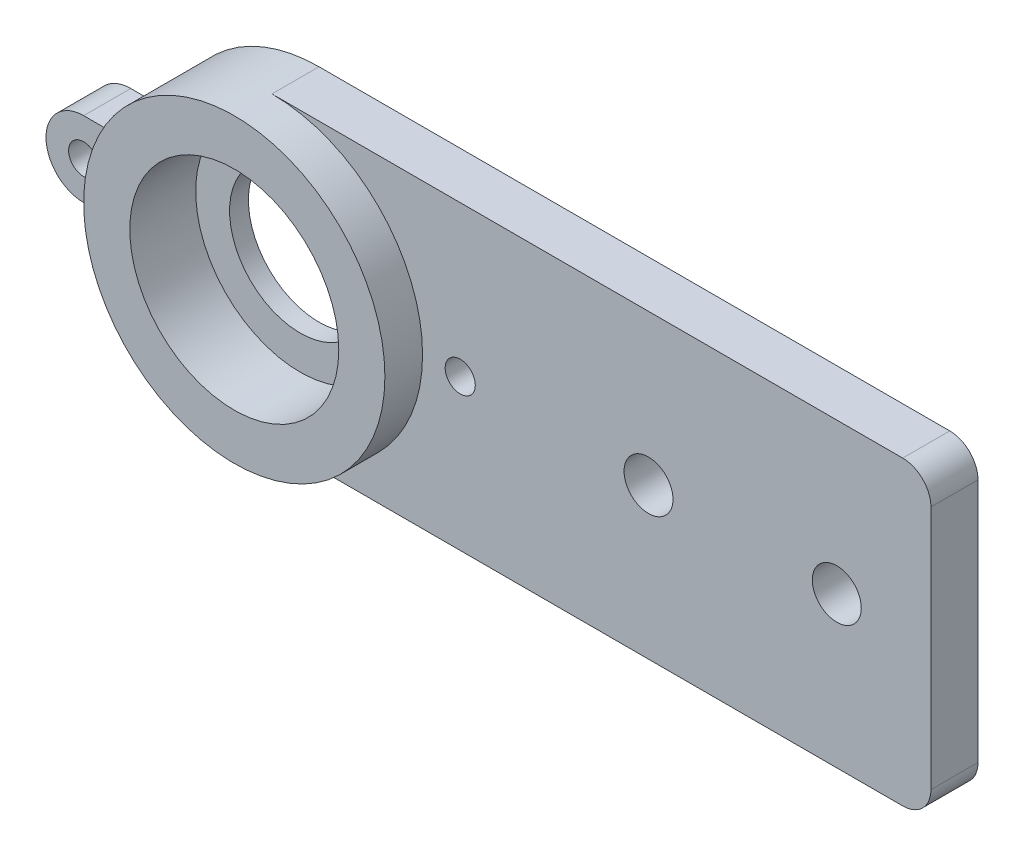
ISO-10303-21;
HEADER;
FILE_DESCRIPTION(('STEP AP214'),'2;1');
FILE_NAME('part.step','',(''),(''),'','','');
FILE_SCHEMA(('AUTOMOTIVE_DESIGN { 1 0 10303 214 1 1 1 1 }'));
ENDSEC;
DATA;
#1=APPLICATION_CONTEXT('core data for automotive mechanical design processes');
#2=APPLICATION_PROTOCOL_DEFINITION('international standard','automotive_design',2000,#1);
#3=PRODUCT_CONTEXT('',#1,'mechanical');
#4=PRODUCT('Part','Part','',(#3));
#5=PRODUCT_RELATED_PRODUCT_CATEGORY('part','',(#4));
#6=PRODUCT_DEFINITION_FORMATION('','',#4);
#7=PRODUCT_DEFINITION_CONTEXT('part definition',#1,'design');
#8=PRODUCT_DEFINITION('design','',#6,#7);
#9=PRODUCT_DEFINITION_SHAPE('','',#8);
#10=(LENGTH_UNIT() NAMED_UNIT(*) SI_UNIT(.MILLI.,.METRE.));
#11=(NAMED_UNIT(*) PLANE_ANGLE_UNIT() SI_UNIT($,.RADIAN.));
#12=(NAMED_UNIT(*) SI_UNIT($,.STERADIAN.) SOLID_ANGLE_UNIT());
#13=UNCERTAINTY_MEASURE_WITH_UNIT(LENGTH_MEASURE(1.E-05),#10,'distance_accuracy_value','');
#14=(GEOMETRIC_REPRESENTATION_CONTEXT(3) GLOBAL_UNCERTAINTY_ASSIGNED_CONTEXT((#13)) GLOBAL_UNIT_ASSIGNED_CONTEXT((#10,
#11,#12)) REPRESENTATION_CONTEXT('',''));
#15=CARTESIAN_POINT('',(0.,0.,0.));
#16=DIRECTION('',(0.,0.,1.));
#17=DIRECTION('',(1.,0.,0.));
#18=AXIS2_PLACEMENT_3D('',#15,#16,#17);
#19=CARTESIAN_POINT('',(0.,0.,2.));
#20=DIRECTION('',(0.,0.,-1.));
#21=DIRECTION('',(-1.,0.,0.));
#22=AXIS2_PLACEMENT_3D('',#19,#20,#21);
#23=CYLINDRICAL_SURFACE('',#22,16.);
#24=CARTESIAN_POINT('',(0.,0.,9.));
#25=DIRECTION('',(0.,0.,1.));
#26=DIRECTION('',(1.,0.,0.));
#27=AXIS2_PLACEMENT_3D('',#24,#25,#26);
#28=CIRCLE('',#27,16.);
#29=CARTESIAN_POINT('',(16.,0.,9.));
#30=VERTEX_POINT('',#29);
#31=EDGE_CURVE('E193',#30,#30,#28,.T.);
#32=ORIENTED_EDGE('',*,*,#31,.F.);
#33=EDGE_LOOP('',(#32));
#34=FACE_BOUND('',#33,.T.);
#35=CARTESIAN_POINT('',(0.,0.,5.));
#36=DIRECTION('',(0.,0.,1.));
#37=DIRECTION('',(1.,0.,0.));
#38=AXIS2_PLACEMENT_3D('',#35,#36,#37);
#39=CIRCLE('',#38,16.);
#40=CARTESIAN_POINT('',(-15.4919333848297,4.,5.));
#41=VERTEX_POINT('',#40);
#42=CARTESIAN_POINT('',(-15.4919333848297,-4.,5.));
#43=VERTEX_POINT('',#42);
#44=EDGE_CURVE('E11',#41,#43,#39,.T.);
#45=ORIENTED_EDGE('',*,*,#44,.T.);
#46=DIRECTION('',(0.,0.,-1.));
#47=VECTOR('',#46,1.);
#48=CARTESIAN_POINT('',(-15.4919333848297,-4.,5.));
#49=LINE('',#48,#47);
#50=CARTESIAN_POINT('',(-15.4919333848297,-4.,0.));
#51=VERTEX_POINT('',#50);
#52=EDGE_CURVE('E150',#43,#51,#49,.T.);
#53=ORIENTED_EDGE('',*,*,#52,.T.);
#54=CARTESIAN_POINT('',(0.,0.,0.));
#55=DIRECTION('',(0.,0.,1.));
#56=DIRECTION('',(1.,0.,0.));
#57=AXIS2_PLACEMENT_3D('',#54,#55,#56);
#58=CIRCLE('',#57,16.);
#59=CARTESIAN_POINT('',(0.,-16.,0.));
#60=VERTEX_POINT('',#59);
#61=EDGE_CURVE('E207',#51,#60,#58,.T.);
#62=ORIENTED_EDGE('',*,*,#61,.T.);
#63=DIRECTION('',(0.,0.,-1.));
#64=VECTOR('',#63,1.);
#65=CARTESIAN_POINT('',(0.,-16.,5.));
#66=LINE('',#65,#64);
#67=CARTESIAN_POINT('',(0.,-16.,5.));
#68=VERTEX_POINT('',#67);
#69=EDGE_CURVE('E187',#68,#60,#66,.T.);
#70=ORIENTED_EDGE('',*,*,#69,.F.);
#71=CARTESIAN_POINT('',(0.,0.,5.));
#72=DIRECTION('',(0.,0.,1.));
#73=DIRECTION('',(1.,0.,0.));
#74=AXIS2_PLACEMENT_3D('',#71,#72,#73);
#75=CIRCLE('',#74,16.);
#76=CARTESIAN_POINT('',(0.,16.,5.));
#77=VERTEX_POINT('',#76);
#78=EDGE_CURVE('E160',#68,#77,#75,.T.);
#79=ORIENTED_EDGE('',*,*,#78,.T.);
#80=DIRECTION('',(0.,0.,-1.));
#81=VECTOR('',#80,1.);
#82=CARTESIAN_POINT('',(0.,16.,5.));
#83=LINE('',#82,#81);
#84=CARTESIAN_POINT('',(0.,16.,0.));
#85=VERTEX_POINT('',#84);
#86=EDGE_CURVE('E171',#77,#85,#83,.T.);
#87=ORIENTED_EDGE('',*,*,#86,.T.);
#88=CARTESIAN_POINT('',(-15.4919333848297,4.,0.));
#89=VERTEX_POINT('',#88);
#90=EDGE_CURVE('E204',#85,#89,#58,.T.);
#91=ORIENTED_EDGE('',*,*,#90,.T.);
#92=DIRECTION('',(0.,0.,-1.));
#93=VECTOR('',#92,1.);
#94=CARTESIAN_POINT('',(-15.4919333848297,4.,5.));
#95=LINE('',#94,#93);
#96=EDGE_CURVE('E53',#41,#89,#95,.T.);
#97=ORIENTED_EDGE('',*,*,#96,.F.);
#98=EDGE_LOOP('',(#45,#53,#62,#70,#79,#87,#91,#97));
#99=FACE_BOUND('',#98,.T.);
#100=ADVANCED_FACE('F35',(#34,#99),#23,.T.);
#101=CARTESIAN_POINT('',(0.,0.,2.));
#102=DIRECTION('',(0.,0.,-1.));
#103=DIRECTION('',(-1.,0.,0.));
#104=AXIS2_PLACEMENT_3D('',#101,#102,#103);
#105=CYLINDRICAL_SURFACE('',#104,7.5);
#106=CARTESIAN_POINT('',(0.,0.,2.));
#107=DIRECTION('',(0.,0.,1.));
#108=DIRECTION('',(1.,0.,0.));
#109=AXIS2_PLACEMENT_3D('',#106,#107,#108);
#110=CIRCLE('',#109,7.5);
#111=CARTESIAN_POINT('',(7.5,0.,2.));
#112=VERTEX_POINT('',#111);
#113=EDGE_CURVE('E201',#112,#112,#110,.T.);
#114=ORIENTED_EDGE('',*,*,#113,.T.);
#115=EDGE_LOOP('',(#114));
#116=FACE_BOUND('',#115,.T.);
#117=CARTESIAN_POINT('',(0.,0.,0.));
#118=DIRECTION('',(0.,0.,1.));
#119=DIRECTION('',(1.,0.,0.));
#120=AXIS2_PLACEMENT_3D('',#117,#118,#119);
#121=CIRCLE('',#120,7.5);
#122=CARTESIAN_POINT('',(7.5,0.,0.));
#123=VERTEX_POINT('',#122);
#124=EDGE_CURVE('E196',#123,#123,#121,.T.);
#125=ORIENTED_EDGE('',*,*,#124,.F.);
#126=EDGE_LOOP('',(#125));
#127=FACE_BOUND('',#126,.T.);
#128=ADVANCED_FACE('F260',(#116,#127),#105,.F.);
#129=CARTESIAN_POINT('',(0.,0.,2.));
#130=DIRECTION('',(0.,0.,1.));
#131=DIRECTION('',(1.,0.,0.));
#132=AXIS2_PLACEMENT_3D('',#129,#130,#131);
#133=PLANE('',#132);
#134=CARTESIAN_POINT('',(0.,0.,2.));
#135=DIRECTION('',(0.,0.,1.));
#136=DIRECTION('',(1.,0.,0.));
#137=AXIS2_PLACEMENT_3D('',#134,#135,#136);
#138=CIRCLE('',#137,11.1);
#139=CARTESIAN_POINT('',(11.1,0.,2.));
#140=VERTEX_POINT('',#139);
#141=EDGE_CURVE('E197',#140,#140,#138,.F.);
#142=ORIENTED_EDGE('',*,*,#141,.F.);
#143=EDGE_LOOP('',(#142));
#144=FACE_BOUND('',#143,.T.);
#145=ORIENTED_EDGE('',*,*,#113,.F.);
#146=EDGE_LOOP('',(#145));
#147=FACE_BOUND('',#146,.T.);
#148=ADVANCED_FACE('F266',(#144,#147),#133,.T.);
#149=CARTESIAN_POINT('',(0.,0.,0.));
#150=DIRECTION('',(0.,0.,1.));
#151=DIRECTION('',(1.,0.,0.));
#152=AXIS2_PLACEMENT_3D('',#149,#150,#151);
#153=PLANE('',#152);
#154=CARTESIAN_POINT('',(20.,0.,0.));
#155=DIRECTION('',(0.,0.,1.));
#156=DIRECTION('',(1.,0.,0.));
#157=AXIS2_PLACEMENT_3D('',#154,#155,#156);
#158=CIRCLE('',#157,1.6);
#159=CARTESIAN_POINT('',(21.6,0.,0.));
#160=VERTEX_POINT('',#159);
#161=EDGE_CURVE('E143',#160,#160,#158,.T.);
#162=ORIENTED_EDGE('',*,*,#161,.T.);
#163=EDGE_LOOP('',(#162));
#164=FACE_BOUND('',#163,.T.);
#165=ORIENTED_EDGE('',*,*,#124,.T.);
#166=EDGE_LOOP('',(#165));
#167=FACE_BOUND('',#166,.T.);
#168=ORIENTED_EDGE('',*,*,#61,.F.);
#169=DIRECTION('',(1.,0.,0.));
#170=VECTOR('',#169,1.);
#171=CARTESIAN_POINT('',(0.,-4.,0.));
#172=LINE('',#171,#170);
#173=CARTESIAN_POINT('',(-20.,-4.,0.));
#174=VERTEX_POINT('',#173);
#175=EDGE_CURVE('E135',#174,#51,#172,.T.);
#176=ORIENTED_EDGE('',*,*,#175,.F.);
#177=CARTESIAN_POINT('',(-20.,0.,0.));
#178=DIRECTION('',(0.,0.,1.));
#179=DIRECTION('',(1.,0.,0.));
#180=AXIS2_PLACEMENT_3D('',#177,#178,#179);
#181=CIRCLE('',#180,4.);
#182=CARTESIAN_POINT('',(-20.,4.,0.));
#183=VERTEX_POINT('',#182);
#184=EDGE_CURVE('E145',#183,#174,#181,.T.);
#185=ORIENTED_EDGE('',*,*,#184,.F.);
#186=DIRECTION('',(1.,0.,0.));
#187=VECTOR('',#186,1.);
#188=CARTESIAN_POINT('',(0.,4.,0.));
#189=LINE('',#188,#187);
#190=EDGE_CURVE('E115',#183,#89,#189,.T.);
#191=ORIENTED_EDGE('',*,*,#190,.T.);
#192=ORIENTED_EDGE('',*,*,#90,.F.);
#193=DIRECTION('',(1.,0.,0.));
#194=VECTOR('',#193,1.);
#195=CARTESIAN_POINT('',(0.,16.,0.));
#196=LINE('',#195,#194);
#197=CARTESIAN_POINT('',(67.,16.,0.));
#198=VERTEX_POINT('',#197);
#199=EDGE_CURVE('E157',#85,#198,#196,.T.);
#200=ORIENTED_EDGE('',*,*,#199,.T.);
#201=CARTESIAN_POINT('',(67.,13.,0.));
#202=DIRECTION('',(0.,0.,1.));
#203=DIRECTION('',(1.,0.,0.));
#204=AXIS2_PLACEMENT_3D('',#201,#202,#203);
#205=CIRCLE('',#204,3.);
#206=CARTESIAN_POINT('',(70.,13.,0.));
#207=VERTEX_POINT('',#206);
#208=EDGE_CURVE('E213',#198,#207,#205,.F.);
#209=ORIENTED_EDGE('',*,*,#208,.T.);
#210=DIRECTION('',(0.,-1.,0.));
#211=VECTOR('',#210,1.);
#212=CARTESIAN_POINT('',(70.,0.,0.));
#213=LINE('',#212,#211);
#214=CARTESIAN_POINT('',(70.,-13.,0.));
#215=VERTEX_POINT('',#214);
#216=EDGE_CURVE('E180',#207,#215,#213,.T.);
#217=ORIENTED_EDGE('',*,*,#216,.T.);
#218=CARTESIAN_POINT('',(67.,-13.,0.));
#219=DIRECTION('',(0.,0.,1.));
#220=DIRECTION('',(1.,0.,0.));
#221=AXIS2_PLACEMENT_3D('',#218,#219,#220);
#222=CIRCLE('',#221,3.);
#223=CARTESIAN_POINT('',(67.,-16.,0.));
#224=VERTEX_POINT('',#223);
#225=EDGE_CURVE('E215',#215,#224,#222,.F.);
#226=ORIENTED_EDGE('',*,*,#225,.T.);
#227=DIRECTION('',(1.,0.,0.));
#228=VECTOR('',#227,1.);
#229=CARTESIAN_POINT('',(0.,-16.,0.));
#230=LINE('',#229,#228);
#231=EDGE_CURVE('E177',#60,#224,#230,.T.);
#232=ORIENTED_EDGE('',*,*,#231,.F.);
#233=EDGE_LOOP('',(#168,#176,#185,#191,#192,#200,#209,#217,#226,#232));
#234=FACE_BOUND('',#233,.T.);
#235=CARTESIAN_POINT('',(60.,0.,0.));
#236=DIRECTION('',(0.,0.,1.));
#237=DIRECTION('',(1.,0.,0.));
#238=AXIS2_PLACEMENT_3D('',#235,#236,#237);
#239=CIRCLE('',#238,2.59999999999999);
#240=CARTESIAN_POINT('',(62.6,0.,0.));
#241=VERTEX_POINT('',#240);
#242=EDGE_CURVE('E119',#241,#241,#239,.T.);
#243=ORIENTED_EDGE('',*,*,#242,.T.);
#244=EDGE_LOOP('',(#243));
#245=FACE_BOUND('',#244,.T.);
#246=CARTESIAN_POINT('',(40.,0.,0.));
#247=DIRECTION('',(0.,0.,1.));
#248=DIRECTION('',(1.,0.,0.));
#249=AXIS2_PLACEMENT_3D('',#246,#247,#248);
#250=CIRCLE('',#249,2.6);
#251=CARTESIAN_POINT('',(42.6,0.,0.));
#252=VERTEX_POINT('',#251);
#253=EDGE_CURVE('E174',#252,#252,#250,.T.);
#254=ORIENTED_EDGE('',*,*,#253,.T.);
#255=EDGE_LOOP('',(#254));
#256=FACE_BOUND('',#255,.T.);
#257=CARTESIAN_POINT('',(-20.,0.,0.));
#258=DIRECTION('',(0.,0.,1.));
#259=DIRECTION('',(1.,0.,0.));
#260=AXIS2_PLACEMENT_3D('',#257,#258,#259);
#261=CIRCLE('',#260,1.6);
#262=CARTESIAN_POINT('',(-18.4,0.,0.));
#263=VERTEX_POINT('',#262);
#264=EDGE_CURVE('E140',#263,#263,#261,.T.);
#265=ORIENTED_EDGE('',*,*,#264,.T.);
#266=EDGE_LOOP('',(#265));
#267=FACE_BOUND('',#266,.T.);
#268=ADVANCED_FACE('F232',(#164,#167,#234,#245,#256,#267),#153,.F.);
#269=CARTESIAN_POINT('',(0.,0.,9.));
#270=DIRECTION('',(0.,0.,-1.));
#271=DIRECTION('',(-1.,0.,0.));
#272=AXIS2_PLACEMENT_3D('',#269,#270,#271);
#273=CYLINDRICAL_SURFACE('',#272,11.1);
#274=ORIENTED_EDGE('',*,*,#141,.T.);
#275=EDGE_LOOP('',(#274));
#276=FACE_BOUND('',#275,.T.);
#277=CARTESIAN_POINT('',(0.,0.,9.));
#278=DIRECTION('',(0.,0.,1.));
#279=DIRECTION('',(1.,0.,0.));
#280=AXIS2_PLACEMENT_3D('',#277,#278,#279);
#281=CIRCLE('',#280,11.1);
#282=CARTESIAN_POINT('',(11.1,0.,9.));
#283=VERTEX_POINT('',#282);
#284=EDGE_CURVE('E190',#283,#283,#281,.T.);
#285=ORIENTED_EDGE('',*,*,#284,.T.);
#286=EDGE_LOOP('',(#285));
#287=FACE_BOUND('',#286,.T.);
#288=ADVANCED_FACE('F272',(#276,#287),#273,.F.);
#289=CARTESIAN_POINT('',(0.,0.,9.));
#290=DIRECTION('',(0.,0.,1.));
#291=DIRECTION('',(1.,0.,0.));
#292=AXIS2_PLACEMENT_3D('',#289,#290,#291);
#293=PLANE('',#292);
#294=ORIENTED_EDGE('',*,*,#284,.F.);
#295=EDGE_LOOP('',(#294));
#296=FACE_BOUND('',#295,.T.);
#297=ORIENTED_EDGE('',*,*,#31,.T.);
#298=EDGE_LOOP('',(#297));
#299=FACE_BOUND('',#298,.T.);
#300=ADVANCED_FACE('F279',(#296,#299),#293,.T.);
#301=CARTESIAN_POINT('',(0.,-16.,5.));
#302=DIRECTION('',(0.,1.,0.));
#303=DIRECTION('',(0.,0.,1.));
#304=AXIS2_PLACEMENT_3D('',#301,#302,#303);
#305=PLANE('',#304);
#306=ORIENTED_EDGE('',*,*,#231,.T.);
#307=DIRECTION('',(0.,0.,-1.));
#308=VECTOR('',#307,1.);
#309=CARTESIAN_POINT('',(67.,-16.,5.));
#310=LINE('',#309,#308);
#311=CARTESIAN_POINT('',(67.,-16.,5.));
#312=VERTEX_POINT('',#311);
#313=EDGE_CURVE('E217',#224,#312,#310,.F.);
#314=ORIENTED_EDGE('',*,*,#313,.T.);
#315=DIRECTION('',(1.,0.,0.));
#316=VECTOR('',#315,1.);
#317=CARTESIAN_POINT('',(0.,-16.,5.));
#318=LINE('',#317,#316);
#319=EDGE_CURVE('E162',#68,#312,#318,.T.);
#320=ORIENTED_EDGE('',*,*,#319,.F.);
#321=ORIENTED_EDGE('',*,*,#69,.T.);
#322=EDGE_LOOP('',(#306,#314,#320,#321));
#323=FACE_BOUND('',#322,.T.);
#324=ADVANCED_FACE('F247',(#323),#305,.F.);
#325=CARTESIAN_POINT('',(70.,0.,5.));
#326=DIRECTION('',(1.,0.,0.));
#327=DIRECTION('',(0.,0.,-1.));
#328=AXIS2_PLACEMENT_3D('',#325,#326,#327);
#329=PLANE('',#328);
#330=DIRECTION('',(0.,-1.,0.));
#331=VECTOR('',#330,1.);
#332=CARTESIAN_POINT('',(70.,0.,5.));
#333=LINE('',#332,#331);
#334=CARTESIAN_POINT('',(70.,13.,5.));
#335=VERTEX_POINT('',#334);
#336=CARTESIAN_POINT('',(70.,-13.,5.));
#337=VERTEX_POINT('',#336);
#338=EDGE_CURVE('E165',#335,#337,#333,.T.);
#339=ORIENTED_EDGE('',*,*,#338,.T.);
#340=DIRECTION('',(0.,0.,-1.));
#341=VECTOR('',#340,1.);
#342=CARTESIAN_POINT('',(70.,-13.,0.));
#343=LINE('',#342,#341);
#344=EDGE_CURVE('E210',#337,#215,#343,.T.);
#345=ORIENTED_EDGE('',*,*,#344,.T.);
#346=ORIENTED_EDGE('',*,*,#216,.F.);
#347=DIRECTION('',(0.,0.,-1.));
#348=VECTOR('',#347,1.);
#349=CARTESIAN_POINT('',(70.,13.,5.));
#350=LINE('',#349,#348);
#351=EDGE_CURVE('E200',#207,#335,#350,.F.);
#352=ORIENTED_EDGE('',*,*,#351,.T.);
#353=EDGE_LOOP('',(#339,#345,#346,#352));
#354=FACE_BOUND('',#353,.T.);
#355=ADVANCED_FACE('F241',(#354),#329,.T.);
#356=CARTESIAN_POINT('',(40.,0.,5.));
#357=DIRECTION('',(0.,0.,-1.));
#358=DIRECTION('',(-1.,0.,0.));
#359=AXIS2_PLACEMENT_3D('',#356,#357,#358);
#360=CYLINDRICAL_SURFACE('',#359,2.6);
#361=CARTESIAN_POINT('',(40.,0.,5.));
#362=DIRECTION('',(0.,0.,1.));
#363=DIRECTION('',(1.,0.,0.));
#364=AXIS2_PLACEMENT_3D('',#361,#362,#363);
#365=CIRCLE('',#364,2.6);
#366=CARTESIAN_POINT('',(42.6,0.,5.));
#367=VERTEX_POINT('',#366);
#368=EDGE_CURVE('E156',#367,#367,#365,.T.);
#369=ORIENTED_EDGE('',*,*,#368,.T.);
#370=EDGE_LOOP('',(#369));
#371=FACE_BOUND('',#370,.T.);
#372=ORIENTED_EDGE('',*,*,#253,.F.);
#373=EDGE_LOOP('',(#372));
#374=FACE_BOUND('',#373,.T.);
#375=ADVANCED_FACE('F287',(#371,#374),#360,.F.);
#376=CARTESIAN_POINT('',(60.,0.,5.));
#377=DIRECTION('',(0.,0.,-1.));
#378=DIRECTION('',(-1.,0.,0.));
#379=AXIS2_PLACEMENT_3D('',#376,#377,#378);
#380=CYLINDRICAL_SURFACE('',#379,2.59999999999999);
#381=CARTESIAN_POINT('',(60.,0.,5.));
#382=DIRECTION('',(0.,0.,1.));
#383=DIRECTION('',(1.,0.,0.));
#384=AXIS2_PLACEMENT_3D('',#381,#382,#383);
#385=CIRCLE('',#384,2.59999999999999);
#386=CARTESIAN_POINT('',(62.6,0.,5.));
#387=VERTEX_POINT('',#386);
#388=EDGE_CURVE('E153',#387,#387,#385,.T.);
#389=ORIENTED_EDGE('',*,*,#388,.T.);
#390=EDGE_LOOP('',(#389));
#391=FACE_BOUND('',#390,.T.);
#392=ORIENTED_EDGE('',*,*,#242,.F.);
#393=EDGE_LOOP('',(#392));
#394=FACE_BOUND('',#393,.T.);
#395=ADVANCED_FACE('F284',(#391,#394),#380,.F.);
#396=CARTESIAN_POINT('',(0.,16.,5.));
#397=DIRECTION('',(0.,1.,0.));
#398=DIRECTION('',(0.,0.,1.));
#399=AXIS2_PLACEMENT_3D('',#396,#397,#398);
#400=PLANE('',#399);
#401=DIRECTION('',(1.,0.,0.));
#402=VECTOR('',#401,1.);
#403=CARTESIAN_POINT('',(0.,16.,5.));
#404=LINE('',#403,#402);
#405=CARTESIAN_POINT('',(67.,16.,5.));
#406=VERTEX_POINT('',#405);
#407=EDGE_CURVE('E168',#77,#406,#404,.T.);
#408=ORIENTED_EDGE('',*,*,#407,.T.);
#409=DIRECTION('',(0.,0.,-1.));
#410=VECTOR('',#409,1.);
#411=CARTESIAN_POINT('',(67.,16.,5.));
#412=LINE('',#411,#410);
#413=EDGE_CURVE('E43',#406,#198,#412,.T.);
#414=ORIENTED_EDGE('',*,*,#413,.T.);
#415=ORIENTED_EDGE('',*,*,#199,.F.);
#416=ORIENTED_EDGE('',*,*,#86,.F.);
#417=EDGE_LOOP('',(#408,#414,#415,#416));
#418=FACE_BOUND('',#417,.T.);
#419=ADVANCED_FACE('F226',(#418),#400,.T.);
#420=CARTESIAN_POINT('',(0.,0.,5.));
#421=DIRECTION('',(0.,0.,1.));
#422=DIRECTION('',(1.,0.,0.));
#423=AXIS2_PLACEMENT_3D('',#420,#421,#422);
#424=PLANE('',#423);
#425=CARTESIAN_POINT('',(20.,0.,5.));
#426=DIRECTION('',(0.,0.,1.));
#427=DIRECTION('',(1.,0.,0.));
#428=AXIS2_PLACEMENT_3D('',#425,#426,#427);
#429=CIRCLE('',#428,1.6);
#430=CARTESIAN_POINT('',(21.6,0.,5.));
#431=VERTEX_POINT('',#430);
#432=EDGE_CURVE('E320',#431,#431,#429,.T.);
#433=ORIENTED_EDGE('',*,*,#432,.F.);
#434=EDGE_LOOP('',(#433));
#435=FACE_BOUND('',#434,.T.);
#436=ORIENTED_EDGE('',*,*,#388,.F.);
#437=EDGE_LOOP('',(#436));
#438=FACE_BOUND('',#437,.T.);
#439=ORIENTED_EDGE('',*,*,#368,.F.);
#440=EDGE_LOOP('',(#439));
#441=FACE_BOUND('',#440,.T.);
#442=ORIENTED_EDGE('',*,*,#319,.T.);
#443=CARTESIAN_POINT('',(67.,-13.,5.));
#444=DIRECTION('',(0.,0.,1.));
#445=DIRECTION('',(1.,0.,0.));
#446=AXIS2_PLACEMENT_3D('',#443,#444,#445);
#447=CIRCLE('',#446,3.);
#448=EDGE_CURVE('E221',#312,#337,#447,.T.);
#449=ORIENTED_EDGE('',*,*,#448,.T.);
#450=ORIENTED_EDGE('',*,*,#338,.F.);
#451=CARTESIAN_POINT('',(67.,13.,5.));
#452=DIRECTION('',(0.,0.,1.));
#453=DIRECTION('',(1.,0.,0.));
#454=AXIS2_PLACEMENT_3D('',#451,#452,#453);
#455=CIRCLE('',#454,3.);
#456=EDGE_CURVE('E219',#335,#406,#455,.T.);
#457=ORIENTED_EDGE('',*,*,#456,.T.);
#458=ORIENTED_EDGE('',*,*,#407,.F.);
#459=ORIENTED_EDGE('',*,*,#78,.F.);
#460=EDGE_LOOP('',(#442,#449,#450,#457,#458,#459));
#461=FACE_BOUND('',#460,.T.);
#462=ADVANCED_FACE('F237',(#435,#438,#441,#461),#424,.T.);
#463=CARTESIAN_POINT('',(67.,-13.,5.));
#464=DIRECTION('',(0.,0.,1.));
#465=DIRECTION('',(1.,0.,0.));
#466=AXIS2_PLACEMENT_3D('',#463,#464,#465);
#467=CYLINDRICAL_SURFACE('',#466,3.);
#468=ORIENTED_EDGE('',*,*,#448,.F.);
#469=ORIENTED_EDGE('',*,*,#313,.F.);
#470=ORIENTED_EDGE('',*,*,#225,.F.);
#471=ORIENTED_EDGE('',*,*,#344,.F.);
#472=EDGE_LOOP('',(#468,#469,#470,#471));
#473=FACE_BOUND('',#472,.T.);
#474=ADVANCED_FACE('F250',(#473),#467,.T.);
#475=CARTESIAN_POINT('',(67.,13.,5.));
#476=DIRECTION('',(0.,0.,-1.));
#477=DIRECTION('',(-1.,0.,0.));
#478=AXIS2_PLACEMENT_3D('',#475,#476,#477);
#479=CYLINDRICAL_SURFACE('',#478,3.);
#480=ORIENTED_EDGE('',*,*,#456,.F.);
#481=ORIENTED_EDGE('',*,*,#351,.F.);
#482=ORIENTED_EDGE('',*,*,#208,.F.);
#483=ORIENTED_EDGE('',*,*,#413,.F.);
#484=EDGE_LOOP('',(#480,#481,#482,#483));
#485=FACE_BOUND('',#484,.T.);
#486=ADVANCED_FACE('F37',(#485),#479,.T.);
#487=CARTESIAN_POINT('',(0.,4.,5.));
#488=DIRECTION('',(0.,1.,0.));
#489=DIRECTION('',(-1.,0.,0.));
#490=AXIS2_PLACEMENT_3D('',#487,#488,#489);
#491=PLANE('',#490);
#492=ORIENTED_EDGE('',*,*,#190,.F.);
#493=DIRECTION('',(0.,0.,-1.));
#494=VECTOR('',#493,1.);
#495=CARTESIAN_POINT('',(-20.,4.,5.));
#496=LINE('',#495,#494);
#497=CARTESIAN_POINT('',(-20.,4.,5.));
#498=VERTEX_POINT('',#497);
#499=EDGE_CURVE('E109',#498,#183,#496,.T.);
#500=ORIENTED_EDGE('',*,*,#499,.F.);
#501=DIRECTION('',(1.,0.,0.));
#502=VECTOR('',#501,1.);
#503=CARTESIAN_POINT('',(0.,4.,5.));
#504=LINE('',#503,#502);
#505=EDGE_CURVE('E113',#498,#41,#504,.T.);
#506=ORIENTED_EDGE('',*,*,#505,.T.);
#507=ORIENTED_EDGE('',*,*,#96,.T.);
#508=EDGE_LOOP('',(#492,#500,#506,#507));
#509=FACE_BOUND('',#508,.T.);
#510=ADVANCED_FACE('F111',(#509),#491,.T.);
#511=CARTESIAN_POINT('',(-20.,0.,5.));
#512=DIRECTION('',(0.,0.,-1.));
#513=DIRECTION('',(-1.,0.,0.));
#514=AXIS2_PLACEMENT_3D('',#511,#512,#513);
#515=CYLINDRICAL_SURFACE('',#514,4.);
#516=ORIENTED_EDGE('',*,*,#184,.T.);
#517=DIRECTION('',(0.,0.,-1.));
#518=VECTOR('',#517,1.);
#519=CARTESIAN_POINT('',(-20.,-4.,5.));
#520=LINE('',#519,#518);
#521=CARTESIAN_POINT('',(-20.,-4.,5.));
#522=VERTEX_POINT('',#521);
#523=EDGE_CURVE('E120',#522,#174,#520,.T.);
#524=ORIENTED_EDGE('',*,*,#523,.F.);
#525=CARTESIAN_POINT('',(-20.,0.,5.));
#526=DIRECTION('',(0.,0.,1.));
#527=DIRECTION('',(1.,0.,0.));
#528=AXIS2_PLACEMENT_3D('',#525,#526,#527);
#529=CIRCLE('',#528,4.);
#530=EDGE_CURVE('E124',#498,#522,#529,.T.);
#531=ORIENTED_EDGE('',*,*,#530,.F.);
#532=ORIENTED_EDGE('',*,*,#499,.T.);
#533=EDGE_LOOP('',(#516,#524,#531,#532));
#534=FACE_BOUND('',#533,.T.);
#535=ADVANCED_FACE('F125',(#534),#515,.T.);
#536=CARTESIAN_POINT('',(0.,-4.,5.));
#537=DIRECTION('',(0.,1.,0.));
#538=DIRECTION('',(0.,0.,1.));
#539=AXIS2_PLACEMENT_3D('',#536,#537,#538);
#540=PLANE('',#539);
#541=ORIENTED_EDGE('',*,*,#175,.T.);
#542=ORIENTED_EDGE('',*,*,#52,.F.);
#543=DIRECTION('',(1.,0.,0.));
#544=VECTOR('',#543,1.);
#545=CARTESIAN_POINT('',(0.,-4.,5.));
#546=LINE('',#545,#544);
#547=EDGE_CURVE('E128',#522,#43,#546,.T.);
#548=ORIENTED_EDGE('',*,*,#547,.F.);
#549=ORIENTED_EDGE('',*,*,#523,.T.);
#550=EDGE_LOOP('',(#541,#542,#548,#549));
#551=FACE_BOUND('',#550,.T.);
#552=ADVANCED_FACE('F301',(#551),#540,.F.);
#553=CARTESIAN_POINT('',(-20.,0.,5.));
#554=DIRECTION('',(0.,0.,-1.));
#555=DIRECTION('',(-1.,0.,0.));
#556=AXIS2_PLACEMENT_3D('',#553,#554,#555);
#557=CYLINDRICAL_SURFACE('',#556,1.6);
#558=CARTESIAN_POINT('',(-20.,0.,5.));
#559=DIRECTION('',(0.,0.,1.));
#560=DIRECTION('',(1.,0.,0.));
#561=AXIS2_PLACEMENT_3D('',#558,#559,#560);
#562=CIRCLE('',#561,1.6);
#563=CARTESIAN_POINT('',(-18.4,0.,5.));
#564=VERTEX_POINT('',#563);
#565=EDGE_CURVE('E132',#564,#564,#562,.T.);
#566=ORIENTED_EDGE('',*,*,#565,.T.);
#567=EDGE_LOOP('',(#566));
#568=FACE_BOUND('',#567,.T.);
#569=ORIENTED_EDGE('',*,*,#264,.F.);
#570=EDGE_LOOP('',(#569));
#571=FACE_BOUND('',#570,.T.);
#572=ADVANCED_FACE('F298',(#568,#571),#557,.F.);
#573=CARTESIAN_POINT('',(0.,0.,5.));
#574=DIRECTION('',(0.,0.,1.));
#575=DIRECTION('',(1.,0.,0.));
#576=AXIS2_PLACEMENT_3D('',#573,#574,#575);
#577=PLANE('',#576);
#578=ORIENTED_EDGE('',*,*,#44,.F.);
#579=ORIENTED_EDGE('',*,*,#505,.F.);
#580=ORIENTED_EDGE('',*,*,#530,.T.);
#581=ORIENTED_EDGE('',*,*,#547,.T.);
#582=EDGE_LOOP('',(#578,#579,#580,#581));
#583=FACE_BOUND('',#582,.T.);
#584=ORIENTED_EDGE('',*,*,#565,.F.);
#585=EDGE_LOOP('',(#584));
#586=FACE_BOUND('',#585,.T.);
#587=ADVANCED_FACE('F130',(#583,#586),#577,.T.);
#588=CARTESIAN_POINT('',(20.,0.,-5.));
#589=DIRECTION('',(0.,0.,1.));
#590=DIRECTION('',(1.,0.,0.));
#591=AXIS2_PLACEMENT_3D('',#588,#589,#590);
#592=CYLINDRICAL_SURFACE('',#591,1.6);
#593=ORIENTED_EDGE('',*,*,#432,.T.);
#594=EDGE_LOOP('',(#593));
#595=FACE_BOUND('',#594,.T.);
#596=ORIENTED_EDGE('',*,*,#161,.F.);
#597=EDGE_LOOP('',(#596));
#598=FACE_BOUND('',#597,.T.);
#599=ADVANCED_FACE('F312',(#595,#598),#592,.F.);
#600=CLOSED_SHELL('',(#100,#128,#148,#268,#288,#300,#324,#355,#375,#395,#419,#462,#474,#486,
#510,#535,#552,#572,#587,#599));
#601=MANIFOLD_SOLID_BREP('B2',#600);
#602=ADVANCED_BREP_SHAPE_REPRESENTATION('',(#18,#601),#14);
#603=SHAPE_DEFINITION_REPRESENTATION(#9,#602);
ENDSEC;
END-ISO-10303-21;
